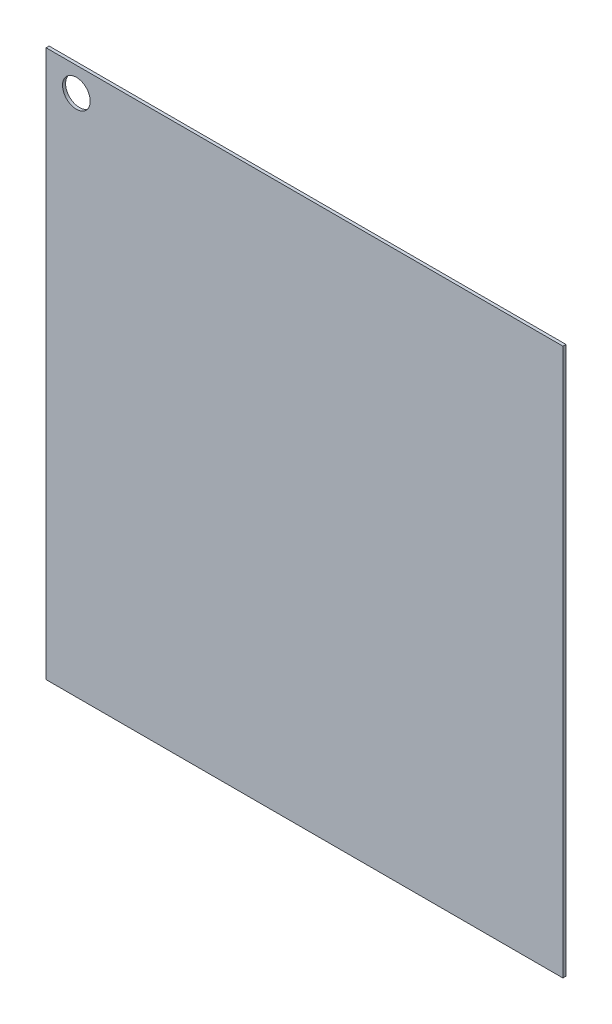
ISO-10303-21;
HEADER;
FILE_DESCRIPTION(('STEP AP214'),'2;1');
FILE_NAME('part.step','',(''),(''),'','','');
FILE_SCHEMA(('AUTOMOTIVE_DESIGN { 1 0 10303 214 1 1 1 1 }'));
ENDSEC;
DATA;
#1=APPLICATION_CONTEXT('core data for automotive mechanical design processes');
#2=APPLICATION_PROTOCOL_DEFINITION('international standard','automotive_design',2000,#1);
#3=PRODUCT_CONTEXT('',#1,'mechanical');
#4=PRODUCT('Part','Part','',(#3));
#5=PRODUCT_RELATED_PRODUCT_CATEGORY('part','',(#4));
#6=PRODUCT_DEFINITION_FORMATION('','',#4);
#7=PRODUCT_DEFINITION_CONTEXT('part definition',#1,'design');
#8=PRODUCT_DEFINITION('design','',#6,#7);
#9=PRODUCT_DEFINITION_SHAPE('','',#8);
#10=(LENGTH_UNIT() NAMED_UNIT(*) SI_UNIT(.MILLI.,.METRE.));
#11=(NAMED_UNIT(*) PLANE_ANGLE_UNIT() SI_UNIT($,.RADIAN.));
#12=(NAMED_UNIT(*) SI_UNIT($,.STERADIAN.) SOLID_ANGLE_UNIT());
#13=UNCERTAINTY_MEASURE_WITH_UNIT(LENGTH_MEASURE(1.E-05),#10,'distance_accuracy_value','');
#14=(GEOMETRIC_REPRESENTATION_CONTEXT(3) GLOBAL_UNCERTAINTY_ASSIGNED_CONTEXT((#13)) GLOBAL_UNIT_ASSIGNED_CONTEXT((#10,
#11,#12)) REPRESENTATION_CONTEXT('',''));
#15=CARTESIAN_POINT('',(0.,0.,0.));
#16=DIRECTION('',(0.,0.,1.));
#17=DIRECTION('',(1.,0.,0.));
#18=AXIS2_PLACEMENT_3D('',#15,#16,#17);
#19=CARTESIAN_POINT('',(-255.,-270.,3.));
#20=DIRECTION('',(1.,0.,0.));
#21=DIRECTION('',(0.,0.,-1.));
#22=AXIS2_PLACEMENT_3D('',#19,#20,#21);
#23=PLANE('',#22);
#24=DIRECTION('',(0.,-1.,0.));
#25=VECTOR('',#24,1.);
#26=CARTESIAN_POINT('',(-255.,-270.,0.));
#27=LINE('',#26,#25);
#28=CARTESIAN_POINT('',(-255.,270.,0.));
#29=VERTEX_POINT('',#28);
#30=CARTESIAN_POINT('',(-255.,-270.,0.));
#31=VERTEX_POINT('',#30);
#32=EDGE_CURVE('E106',#29,#31,#27,.T.);
#33=ORIENTED_EDGE('',*,*,#32,.T.);
#34=DIRECTION('',(0.,0.,-1.));
#35=VECTOR('',#34,1.);
#36=CARTESIAN_POINT('',(-255.,-270.,3.));
#37=LINE('',#36,#35);
#38=CARTESIAN_POINT('',(-255.,-270.,3.));
#39=VERTEX_POINT('',#38);
#40=EDGE_CURVE('E11',#39,#31,#37,.T.);
#41=ORIENTED_EDGE('',*,*,#40,.F.);
#42=DIRECTION('',(0.,-1.,0.));
#43=VECTOR('',#42,1.);
#44=CARTESIAN_POINT('',(-255.,-270.,3.));
#45=LINE('',#44,#43);
#46=CARTESIAN_POINT('',(-255.,270.,3.));
#47=VERTEX_POINT('',#46);
#48=EDGE_CURVE('E90',#47,#39,#45,.T.);
#49=ORIENTED_EDGE('',*,*,#48,.F.);
#50=DIRECTION('',(0.,0.,-1.));
#51=VECTOR('',#50,1.);
#52=CARTESIAN_POINT('',(-255.,270.,3.));
#53=LINE('',#52,#51);
#54=EDGE_CURVE('E102',#47,#29,#53,.T.);
#55=ORIENTED_EDGE('',*,*,#54,.T.);
#56=EDGE_LOOP('',(#33,#41,#49,#55));
#57=FACE_BOUND('',#56,.T.);
#58=ADVANCED_FACE('F38',(#57),#23,.F.);
#59=CARTESIAN_POINT('',(255.,-270.,3.));
#60=DIRECTION('',(0.,1.,0.));
#61=DIRECTION('',(-1.,0.,0.));
#62=AXIS2_PLACEMENT_3D('',#59,#60,#61);
#63=PLANE('',#62);
#64=DIRECTION('',(1.,0.,0.));
#65=VECTOR('',#64,1.);
#66=CARTESIAN_POINT('',(255.,-270.,0.));
#67=LINE('',#66,#65);
#68=CARTESIAN_POINT('',(255.,-270.,0.));
#69=VERTEX_POINT('',#68);
#70=EDGE_CURVE('E95',#31,#69,#67,.T.);
#71=ORIENTED_EDGE('',*,*,#70,.T.);
#72=DIRECTION('',(0.,0.,-1.));
#73=VECTOR('',#72,1.);
#74=CARTESIAN_POINT('',(255.,-270.,3.));
#75=LINE('',#74,#73);
#76=CARTESIAN_POINT('',(255.,-270.,3.));
#77=VERTEX_POINT('',#76);
#78=EDGE_CURVE('E47',#77,#69,#75,.T.);
#79=ORIENTED_EDGE('',*,*,#78,.F.);
#80=DIRECTION('',(1.,0.,0.));
#81=VECTOR('',#80,1.);
#82=CARTESIAN_POINT('',(255.,-270.,3.));
#83=LINE('',#82,#81);
#84=EDGE_CURVE('E85',#39,#77,#83,.T.);
#85=ORIENTED_EDGE('',*,*,#84,.F.);
#86=ORIENTED_EDGE('',*,*,#40,.T.);
#87=EDGE_LOOP('',(#71,#79,#85,#86));
#88=FACE_BOUND('',#87,.T.);
#89=ADVANCED_FACE('F94',(#88),#63,.F.);
#90=CARTESIAN_POINT('',(255.,-270.,3.));
#91=DIRECTION('',(-1.,0.,0.));
#92=DIRECTION('',(0.,0.,1.));
#93=AXIS2_PLACEMENT_3D('',#90,#91,#92);
#94=PLANE('',#93);
#95=DIRECTION('',(0.,1.,0.));
#96=VECTOR('',#95,1.);
#97=CARTESIAN_POINT('',(255.,-270.,0.));
#98=LINE('',#97,#96);
#99=CARTESIAN_POINT('',(255.,270.,0.));
#100=VERTEX_POINT('',#99);
#101=EDGE_CURVE('E72',#69,#100,#98,.T.);
#102=ORIENTED_EDGE('',*,*,#101,.T.);
#103=DIRECTION('',(0.,0.,-1.));
#104=VECTOR('',#103,1.);
#105=CARTESIAN_POINT('',(255.,270.,3.));
#106=LINE('',#105,#104);
#107=CARTESIAN_POINT('',(255.,270.,3.));
#108=VERTEX_POINT('',#107);
#109=EDGE_CURVE('E97',#108,#100,#106,.T.);
#110=ORIENTED_EDGE('',*,*,#109,.F.);
#111=DIRECTION('',(0.,1.,0.));
#112=VECTOR('',#111,1.);
#113=CARTESIAN_POINT('',(255.,-270.,3.));
#114=LINE('',#113,#112);
#115=EDGE_CURVE('E88',#77,#108,#114,.T.);
#116=ORIENTED_EDGE('',*,*,#115,.F.);
#117=ORIENTED_EDGE('',*,*,#78,.T.);
#118=EDGE_LOOP('',(#102,#110,#116,#117));
#119=FACE_BOUND('',#118,.T.);
#120=ADVANCED_FACE('F98',(#119),#94,.F.);
#121=CARTESIAN_POINT('',(255.,270.,3.));
#122=DIRECTION('',(0.,-1.,0.));
#123=DIRECTION('',(1.,0.,0.));
#124=AXIS2_PLACEMENT_3D('',#121,#122,#123);
#125=PLANE('',#124);
#126=DIRECTION('',(-1.,0.,0.));
#127=VECTOR('',#126,1.);
#128=CARTESIAN_POINT('',(255.,270.,0.));
#129=LINE('',#128,#127);
#130=EDGE_CURVE('E78',#100,#29,#129,.T.);
#131=ORIENTED_EDGE('',*,*,#130,.T.);
#132=ORIENTED_EDGE('',*,*,#54,.F.);
#133=DIRECTION('',(-1.,0.,0.));
#134=VECTOR('',#133,1.);
#135=CARTESIAN_POINT('',(255.,270.,3.));
#136=LINE('',#135,#134);
#137=EDGE_CURVE('E55',#108,#47,#136,.T.);
#138=ORIENTED_EDGE('',*,*,#137,.F.);
#139=ORIENTED_EDGE('',*,*,#109,.T.);
#140=EDGE_LOOP('',(#131,#132,#138,#139));
#141=FACE_BOUND('',#140,.T.);
#142=ADVANCED_FACE('F120',(#141),#125,.F.);
#143=CARTESIAN_POINT('',(0.,0.,3.));
#144=DIRECTION('',(0.,0.,1.));
#145=DIRECTION('',(1.,0.,0.));
#146=AXIS2_PLACEMENT_3D('',#143,#144,#145);
#147=PLANE('',#146);
#148=CARTESIAN_POINT('',(-225.092859776112,246.042633007136,3.));
#149=DIRECTION('',(0.,0.,1.));
#150=DIRECTION('',(1.,0.,0.));
#151=AXIS2_PLACEMENT_3D('',#148,#149,#150);
#152=CIRCLE('',#151,13.6583332742679);
#153=CARTESIAN_POINT('',(-211.434526501844,246.042633007136,3.));
#154=VERTEX_POINT('',#153);
#155=EDGE_CURVE('E130',#154,#154,#152,.T.);
#156=ORIENTED_EDGE('',*,*,#155,.F.);
#157=EDGE_LOOP('',(#156));
#158=FACE_BOUND('',#157,.T.);
#159=ORIENTED_EDGE('',*,*,#48,.T.);
#160=ORIENTED_EDGE('',*,*,#84,.T.);
#161=ORIENTED_EDGE('',*,*,#115,.T.);
#162=ORIENTED_EDGE('',*,*,#137,.T.);
#163=EDGE_LOOP('',(#159,#160,#161,#162));
#164=FACE_BOUND('',#163,.T.);
#165=ADVANCED_FACE('F86',(#158,#164),#147,.T.);
#166=CARTESIAN_POINT('',(0.,0.,0.));
#167=DIRECTION('',(0.,0.,1.));
#168=DIRECTION('',(1.,0.,0.));
#169=AXIS2_PLACEMENT_3D('',#166,#167,#168);
#170=PLANE('',#169);
#171=CARTESIAN_POINT('',(-225.092859776112,246.042633007136,0.));
#172=DIRECTION('',(0.,0.,1.));
#173=DIRECTION('',(1.,0.,0.));
#174=AXIS2_PLACEMENT_3D('',#171,#172,#173);
#175=CIRCLE('',#174,13.6583332742679);
#176=CARTESIAN_POINT('',(-211.434526501844,246.042633007136,0.));
#177=VERTEX_POINT('',#176);
#178=EDGE_CURVE('E110',#177,#177,#175,.F.);
#179=ORIENTED_EDGE('',*,*,#178,.F.);
#180=EDGE_LOOP('',(#179));
#181=FACE_BOUND('',#180,.T.);
#182=ORIENTED_EDGE('',*,*,#32,.F.);
#183=ORIENTED_EDGE('',*,*,#130,.F.);
#184=ORIENTED_EDGE('',*,*,#101,.F.);
#185=ORIENTED_EDGE('',*,*,#70,.F.);
#186=EDGE_LOOP('',(#182,#183,#184,#185));
#187=FACE_BOUND('',#186,.T.);
#188=ADVANCED_FACE('F123',(#181,#187),#170,.F.);
#189=CARTESIAN_POINT('',(-225.092859776112,246.042633007136,-0.00100000000000013));
#190=DIRECTION('',(0.,0.,1.));
#191=DIRECTION('',(1.,0.,0.));
#192=AXIS2_PLACEMENT_3D('',#189,#190,#191);
#193=CYLINDRICAL_SURFACE('',#192,13.6583332742679);
#194=CARTESIAN_POINT('',(-211.434526501844,246.042633007136,3.));
#195=CARTESIAN_POINT('',(-211.434526501844,246.042633007136,2.96875));
#196=CARTESIAN_POINT('',(-211.434526501844,246.042633007136,2.9375));
#197=CARTESIAN_POINT('',(-211.434526501844,246.042633007136,2.875));
#198=CARTESIAN_POINT('',(-211.434526501844,246.042633007136,2.84375));
#199=CARTESIAN_POINT('',(-211.434526501844,246.042633007136,2.78125));
#200=CARTESIAN_POINT('',(-211.434526501844,246.042633007136,2.75));
#201=CARTESIAN_POINT('',(-211.434526501844,246.042633007136,2.6875));
#202=CARTESIAN_POINT('',(-211.434526501844,246.042633007136,2.65625));
#203=CARTESIAN_POINT('',(-211.434526501844,246.042633007136,2.59375));
#204=CARTESIAN_POINT('',(-211.434526501844,246.042633007136,2.5625));
#205=CARTESIAN_POINT('',(-211.434526501844,246.042633007136,2.5));
#206=CARTESIAN_POINT('',(-211.434526501844,246.042633007136,2.46875));
#207=CARTESIAN_POINT('',(-211.434526501844,246.042633007136,2.40625));
#208=CARTESIAN_POINT('',(-211.434526501844,246.042633007136,2.375));
#209=CARTESIAN_POINT('',(-211.434526501844,246.042633007136,2.3125));
#210=CARTESIAN_POINT('',(-211.434526501844,246.042633007136,2.28125));
#211=CARTESIAN_POINT('',(-211.434526501844,246.042633007136,2.21875));
#212=CARTESIAN_POINT('',(-211.434526501844,246.042633007136,2.1875));
#213=CARTESIAN_POINT('',(-211.434526501844,246.042633007136,2.125));
#214=CARTESIAN_POINT('',(-211.434526501844,246.042633007136,2.09375));
#215=CARTESIAN_POINT('',(-211.434526501844,246.042633007136,2.03125));
#216=CARTESIAN_POINT('',(-211.434526501844,246.042633007136,2.));
#217=CARTESIAN_POINT('',(-211.434526501844,246.042633007136,1.9375));
#218=CARTESIAN_POINT('',(-211.434526501844,246.042633007136,1.90625));
#219=CARTESIAN_POINT('',(-211.434526501844,246.042633007136,1.84375));
#220=CARTESIAN_POINT('',(-211.434526501844,246.042633007136,1.8125));
#221=CARTESIAN_POINT('',(-211.434526501844,246.042633007136,1.75));
#222=CARTESIAN_POINT('',(-211.434526501844,246.042633007136,1.71875));
#223=CARTESIAN_POINT('',(-211.434526501844,246.042633007136,1.65625));
#224=CARTESIAN_POINT('',(-211.434526501844,246.042633007136,1.625));
#225=CARTESIAN_POINT('',(-211.434526501844,246.042633007136,1.5625));
#226=CARTESIAN_POINT('',(-211.434526501844,246.042633007136,1.53125));
#227=CARTESIAN_POINT('',(-211.434526501844,246.042633007136,1.46875));
#228=CARTESIAN_POINT('',(-211.434526501844,246.042633007136,1.4375));
#229=CARTESIAN_POINT('',(-211.434526501844,246.042633007136,1.375));
#230=CARTESIAN_POINT('',(-211.434526501844,246.042633007136,1.34375));
#231=CARTESIAN_POINT('',(-211.434526501844,246.042633007136,1.28125));
#232=CARTESIAN_POINT('',(-211.434526501844,246.042633007136,1.25));
#233=CARTESIAN_POINT('',(-211.434526501844,246.042633007136,1.1875));
#234=CARTESIAN_POINT('',(-211.434526501844,246.042633007136,1.15625));
#235=CARTESIAN_POINT('',(-211.434526501844,246.042633007136,1.09375));
#236=CARTESIAN_POINT('',(-211.434526501844,246.042633007136,1.0625));
#237=CARTESIAN_POINT('',(-211.434526501844,246.042633007136,1.));
#238=CARTESIAN_POINT('',(-211.434526501844,246.042633007136,0.96875));
#239=CARTESIAN_POINT('',(-211.434526501844,246.042633007136,0.90625));
#240=CARTESIAN_POINT('',(-211.434526501844,246.042633007136,0.875));
#241=CARTESIAN_POINT('',(-211.434526501844,246.042633007136,0.8125));
#242=CARTESIAN_POINT('',(-211.434526501844,246.042633007136,0.78125));
#243=CARTESIAN_POINT('',(-211.434526501844,246.042633007136,0.71875));
#244=CARTESIAN_POINT('',(-211.434526501844,246.042633007136,0.6875));
#245=CARTESIAN_POINT('',(-211.434526501844,246.042633007136,0.625));
#246=CARTESIAN_POINT('',(-211.434526501844,246.042633007136,0.59375));
#247=CARTESIAN_POINT('',(-211.434526501844,246.042633007136,0.53125));
#248=CARTESIAN_POINT('',(-211.434526501844,246.042633007136,0.5));
#249=CARTESIAN_POINT('',(-211.434526501844,246.042633007136,0.4375));
#250=CARTESIAN_POINT('',(-211.434526501844,246.042633007136,0.40625));
#251=CARTESIAN_POINT('',(-211.434526501844,246.042633007136,0.34375));
#252=CARTESIAN_POINT('',(-211.434526501844,246.042633007136,0.3125));
#253=CARTESIAN_POINT('',(-211.434526501844,246.042633007136,0.25));
#254=CARTESIAN_POINT('',(-211.434526501844,246.042633007136,0.21875));
#255=CARTESIAN_POINT('',(-211.434526501844,246.042633007136,0.15625));
#256=CARTESIAN_POINT('',(-211.434526501844,246.042633007136,0.125));
#257=CARTESIAN_POINT('',(-211.434526501844,246.042633007136,0.0625000000000001));
#258=CARTESIAN_POINT('',(-211.434526501844,246.042633007136,0.0312500000000001));
#259=CARTESIAN_POINT('',(-211.434526501844,246.042633007136,0.));
#260=B_SPLINE_CURVE_WITH_KNOTS('',3,(#194,#195,#196,#197,#198,#199,#200,#201,#202,#203,#204,
#205,#206,#207,#208,#209,#210,#211,#212,#213,#214,#215,#216,#217,#218,#219,#220,#221,#222,#223,
#224,#225,#226,#227,#228,#229,#230,#231,#232,#233,#234,#235,#236,#237,#238,#239,#240,#241,#242,
#243,#244,#245,#246,#247,#248,#249,#250,#251,#252,#253,#254,#255,#256,#257,#258,#259),
.UNSPECIFIED.,.F.,.F.,(4,2,2,2,2,2,2,2,2,2,2,2,2,2,2,2,2,2,2,2,2,2,2,2,2,2,2,2,2,2,2,2,4),(0.,
0.0937500000000001,0.1875,0.28125,0.375,0.46875,0.5625,0.65625,0.75,0.84375,0.9375,1.03125,
1.125,1.21875,1.3125,1.40625,1.5,1.59375,1.6875,1.78125,1.875,1.96875,2.0625,2.15625,2.25,
2.34375,2.4375,2.53125,2.625,2.71875,2.8125,2.90625,3.),.UNSPECIFIED.);
#261=EDGE_CURVE('BSEAM135',#154,#177,#260,.T.);
#262=ORIENTED_EDGE('',*,*,#155,.T.);
#263=ORIENTED_EDGE('',*,*,#178,.T.);
#264=ORIENTED_EDGE('',*,*,#261,.T.);
#265=ORIENTED_EDGE('',*,*,#261,.F.);
#266=EDGE_LOOP('',(#262,#264,#263,#265));
#267=FACE_BOUND('',#266,.T.);
#268=ADVANCED_FACE('F135',(#267),#193,.F.);
#269=CLOSED_SHELL('',(#58,#89,#120,#142,#165,#188,#268));
#270=MANIFOLD_SOLID_BREP('B2',#269);
#271=ADVANCED_BREP_SHAPE_REPRESENTATION('',(#18,#270),#14);
#272=SHAPE_DEFINITION_REPRESENTATION(#9,#271);
ENDSEC;
END-ISO-10303-21;
